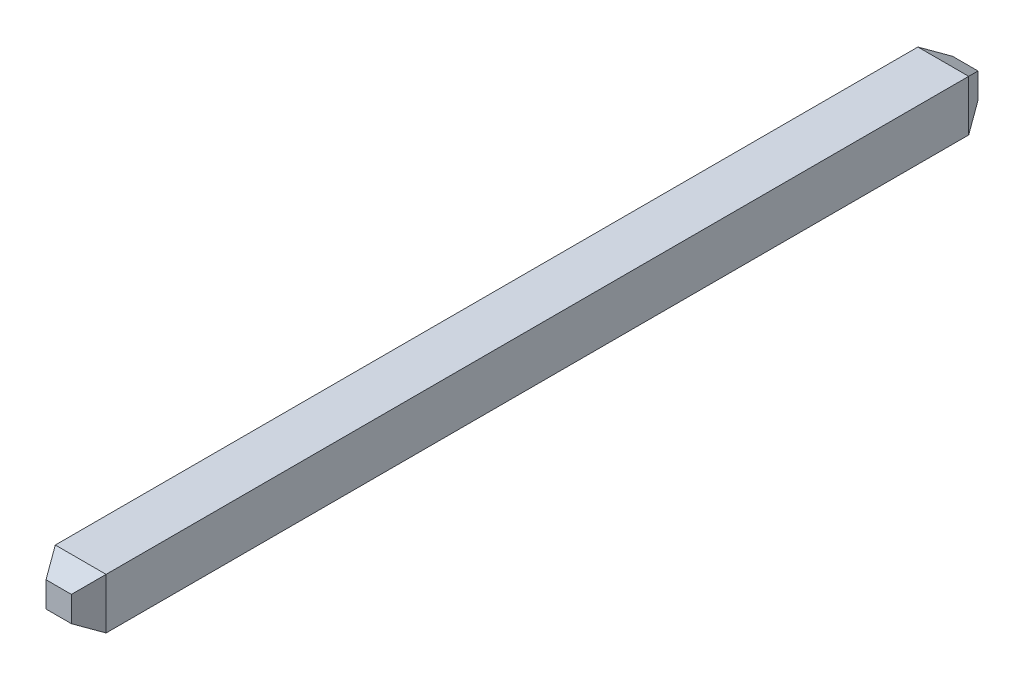
ISO-10303-21;
HEADER;
FILE_DESCRIPTION(('STEP AP214'),'2;1');
FILE_NAME('part.step','',(''),(''),'','','');
FILE_SCHEMA(('AUTOMOTIVE_DESIGN { 1 0 10303 214 1 1 1 1 }'));
ENDSEC;
DATA;
#1=APPLICATION_CONTEXT('core data for automotive mechanical design processes');
#2=APPLICATION_PROTOCOL_DEFINITION('international standard','automotive_design',2000,#1);
#3=PRODUCT_CONTEXT('',#1,'mechanical');
#4=PRODUCT('Part','Part','',(#3));
#5=PRODUCT_RELATED_PRODUCT_CATEGORY('part','',(#4));
#6=PRODUCT_DEFINITION_FORMATION('','',#4);
#7=PRODUCT_DEFINITION_CONTEXT('part definition',#1,'design');
#8=PRODUCT_DEFINITION('design','',#6,#7);
#9=PRODUCT_DEFINITION_SHAPE('','',#8);
#10=(LENGTH_UNIT() NAMED_UNIT(*) SI_UNIT(.MILLI.,.METRE.));
#11=(NAMED_UNIT(*) PLANE_ANGLE_UNIT() SI_UNIT($,.RADIAN.));
#12=(NAMED_UNIT(*) SI_UNIT($,.STERADIAN.) SOLID_ANGLE_UNIT());
#13=UNCERTAINTY_MEASURE_WITH_UNIT(LENGTH_MEASURE(1.E-05),#10,'distance_accuracy_value','');
#14=(GEOMETRIC_REPRESENTATION_CONTEXT(3) GLOBAL_UNCERTAINTY_ASSIGNED_CONTEXT((#13)) GLOBAL_UNIT_ASSIGNED_CONTEXT((#10,
#11,#12)) REPRESENTATION_CONTEXT('',''));
#15=CARTESIAN_POINT('',(0.,0.,0.));
#16=DIRECTION('',(0.,0.,1.));
#17=DIRECTION('',(1.,0.,0.));
#18=AXIS2_PLACEMENT_3D('',#15,#16,#17);
#19=CARTESIAN_POINT('',(2.865,0.325,-3.));
#20=DIRECTION('',(0.,1.,0.));
#21=DIRECTION('',(-1.,0.,0.));
#22=AXIS2_PLACEMENT_3D('',#19,#20,#21);
#23=PLANE('',#22);
#24=DIRECTION('',(-1.,0.,0.));
#25=VECTOR('',#24,1.);
#26=CARTESIAN_POINT('',(2.865,0.325,8.31854174377006));
#27=LINE('',#26,#25);
#28=CARTESIAN_POINT('',(2.865,0.325,8.31854174377006));
#29=VERTEX_POINT('',#28);
#30=CARTESIAN_POINT('',(2.215,0.325,8.31854174377006));
#31=VERTEX_POINT('',#30);
#32=EDGE_CURVE('E11',#29,#31,#27,.T.);
#33=ORIENTED_EDGE('',*,*,#32,.F.);
#34=DIRECTION('',(0.,0.,1.));
#35=VECTOR('',#34,1.);
#36=CARTESIAN_POINT('',(2.865,0.325,-2.71854174377006));
#37=LINE('',#36,#35);
#38=CARTESIAN_POINT('',(2.865,0.325,-2.71854174377006));
#39=VERTEX_POINT('',#38);
#40=EDGE_CURVE('E24',#39,#29,#37,.T.);
#41=ORIENTED_EDGE('',*,*,#40,.F.);
#42=DIRECTION('',(-1.,0.,0.));
#43=VECTOR('',#42,1.);
#44=CARTESIAN_POINT('',(2.865,0.325,-2.71854174377006));
#45=LINE('',#44,#43);
#46=CARTESIAN_POINT('',(2.215,0.325,-2.71854174377006));
#47=VERTEX_POINT('',#46);
#48=EDGE_CURVE('E155',#39,#47,#45,.T.);
#49=ORIENTED_EDGE('',*,*,#48,.T.);
#50=DIRECTION('',(0.,0.,1.));
#51=VECTOR('',#50,1.);
#52=CARTESIAN_POINT('',(2.215,0.325,-2.71854174377006));
#53=LINE('',#52,#51);
#54=EDGE_CURVE('E153',#47,#31,#53,.T.);
#55=ORIENTED_EDGE('',*,*,#54,.T.);
#56=EDGE_LOOP('',(#33,#41,#49,#55));
#57=FACE_BOUND('',#56,.T.);
#58=ADVANCED_FACE('F17',(#57),#23,.T.);
#59=CARTESIAN_POINT('',(3.75291651245989,0.325,8.31854174377006));
#60=DIRECTION('',(0.,0.86602540378444,0.499999999999997));
#61=DIRECTION('',(-1.,0.,0.));
#62=AXIS2_PLACEMENT_3D('',#59,#60,#61);
#63=PLANE('',#62);
#64=ORIENTED_EDGE('',*,*,#32,.T.);
#65=DIRECTION('',(0.447213595499954,-0.447213595499956,0.774596669241487));
#66=VECTOR('',#65,1.);
#67=CARTESIAN_POINT('',(2.215,0.325,8.31854174377006));
#68=LINE('',#67,#66);
#69=CARTESIAN_POINT('',(2.3775,0.1625,8.6));
#70=VERTEX_POINT('',#69);
#71=EDGE_CURVE('E151',#31,#70,#68,.T.);
#72=ORIENTED_EDGE('',*,*,#71,.T.);
#73=DIRECTION('',(-1.,0.,0.));
#74=VECTOR('',#73,1.);
#75=CARTESIAN_POINT('',(2.7025,0.1625,8.6));
#76=LINE('',#75,#74);
#77=CARTESIAN_POINT('',(2.7025,0.1625,8.6));
#78=VERTEX_POINT('',#77);
#79=EDGE_CURVE('E148',#78,#70,#76,.T.);
#80=ORIENTED_EDGE('',*,*,#79,.F.);
#81=DIRECTION('',(-0.447213595499957,-0.447213595499955,0.774596669241486));
#82=VECTOR('',#81,1.);
#83=CARTESIAN_POINT('',(2.865,0.325,8.31854174377006));
#84=LINE('',#83,#82);
#85=EDGE_CURVE('E145',#29,#78,#84,.T.);
#86=ORIENTED_EDGE('',*,*,#85,.F.);
#87=EDGE_LOOP('',(#64,#72,#80,#86));
#88=FACE_BOUND('',#87,.T.);
#89=ADVANCED_FACE('F161',(#88),#63,.T.);
#90=CARTESIAN_POINT('',(2.865,-0.325,-3.));
#91=DIRECTION('',(1.,0.,0.));
#92=DIRECTION('',(0.,1.,0.));
#93=AXIS2_PLACEMENT_3D('',#90,#91,#92);
#94=PLANE('',#93);
#95=DIRECTION('',(0.,1.,0.));
#96=VECTOR('',#95,1.);
#97=CARTESIAN_POINT('',(2.865,-0.325,8.31854174377006));
#98=LINE('',#97,#96);
#99=CARTESIAN_POINT('',(2.865,-0.325,8.31854174377006));
#100=VERTEX_POINT('',#99);
#101=EDGE_CURVE('E142',#100,#29,#98,.T.);
#102=ORIENTED_EDGE('',*,*,#101,.F.);
#103=DIRECTION('',(0.,0.,1.));
#104=VECTOR('',#103,1.);
#105=CARTESIAN_POINT('',(2.865,-0.325,-2.71854174377006));
#106=LINE('',#105,#104);
#107=CARTESIAN_POINT('',(2.865,-0.325,-2.71854174377006));
#108=VERTEX_POINT('',#107);
#109=EDGE_CURVE('E139',#108,#100,#106,.T.);
#110=ORIENTED_EDGE('',*,*,#109,.F.);
#111=DIRECTION('',(0.,1.,0.));
#112=VECTOR('',#111,1.);
#113=CARTESIAN_POINT('',(2.865,-0.325,-2.71854174377006));
#114=LINE('',#113,#112);
#115=EDGE_CURVE('E136',#108,#39,#114,.T.);
#116=ORIENTED_EDGE('',*,*,#115,.T.);
#117=ORIENTED_EDGE('',*,*,#40,.T.);
#118=EDGE_LOOP('',(#102,#110,#116,#117));
#119=FACE_BOUND('',#118,.T.);
#120=ADVANCED_FACE('F157',(#119),#94,.T.);
#121=CARTESIAN_POINT('',(3.75291651245989,0.325,-2.71854174377006));
#122=DIRECTION('',(0.,-0.866025403784438,0.5));
#123=DIRECTION('',(-1.,0.,0.));
#124=AXIS2_PLACEMENT_3D('',#121,#122,#123);
#125=PLANE('',#124);
#126=ORIENTED_EDGE('',*,*,#48,.F.);
#127=DIRECTION('',(-0.447213595499958,-0.447213595499958,-0.774596669241483));
#128=VECTOR('',#127,1.);
#129=CARTESIAN_POINT('',(2.865,0.325,-2.71854174377006));
#130=LINE('',#129,#128);
#131=CARTESIAN_POINT('',(2.7025,0.1625,-3.));
#132=VERTEX_POINT('',#131);
#133=EDGE_CURVE('E134',#39,#132,#130,.T.);
#134=ORIENTED_EDGE('',*,*,#133,.T.);
#135=DIRECTION('',(-1.,0.,0.));
#136=VECTOR('',#135,1.);
#137=CARTESIAN_POINT('',(2.7025,0.1625,-3.));
#138=LINE('',#137,#136);
#139=CARTESIAN_POINT('',(2.3775,0.1625,-3.));
#140=VERTEX_POINT('',#139);
#141=EDGE_CURVE('E132',#132,#140,#138,.T.);
#142=ORIENTED_EDGE('',*,*,#141,.T.);
#143=DIRECTION('',(0.447213595499957,-0.447213595499958,-0.774596669241484));
#144=VECTOR('',#143,1.);
#145=CARTESIAN_POINT('',(2.215,0.325,-2.71854174377006));
#146=LINE('',#145,#144);
#147=EDGE_CURVE('E96',#47,#140,#146,.T.);
#148=ORIENTED_EDGE('',*,*,#147,.F.);
#149=EDGE_LOOP('',(#126,#134,#142,#148));
#150=FACE_BOUND('',#149,.T.);
#151=ADVANCED_FACE('F177',(#150),#125,.F.);
#152=CARTESIAN_POINT('',(2.215,0.325,-3.));
#153=DIRECTION('',(-1.,0.,0.));
#154=DIRECTION('',(0.,-1.,0.));
#155=AXIS2_PLACEMENT_3D('',#152,#153,#154);
#156=PLANE('',#155);
#157=DIRECTION('',(0.,-1.,0.));
#158=VECTOR('',#157,1.);
#159=CARTESIAN_POINT('',(2.215,0.325,8.31854174377006));
#160=LINE('',#159,#158);
#161=CARTESIAN_POINT('',(2.215,-0.325,8.31854174377006));
#162=VERTEX_POINT('',#161);
#163=EDGE_CURVE('E129',#31,#162,#160,.T.);
#164=ORIENTED_EDGE('',*,*,#163,.F.);
#165=ORIENTED_EDGE('',*,*,#54,.F.);
#166=DIRECTION('',(0.,-1.,0.));
#167=VECTOR('',#166,1.);
#168=CARTESIAN_POINT('',(2.215,0.325,-2.71854174377006));
#169=LINE('',#168,#167);
#170=CARTESIAN_POINT('',(2.215,-0.325,-2.71854174377006));
#171=VERTEX_POINT('',#170);
#172=EDGE_CURVE('E127',#47,#171,#169,.T.);
#173=ORIENTED_EDGE('',*,*,#172,.T.);
#174=DIRECTION('',(0.,0.,1.));
#175=VECTOR('',#174,1.);
#176=CARTESIAN_POINT('',(2.215,-0.325,-2.71854174377006));
#177=LINE('',#176,#175);
#178=EDGE_CURVE('E124',#171,#162,#177,.T.);
#179=ORIENTED_EDGE('',*,*,#178,.T.);
#180=EDGE_LOOP('',(#164,#165,#173,#179));
#181=FACE_BOUND('',#180,.T.);
#182=ADVANCED_FACE('F182',(#181),#156,.T.);
#183=CARTESIAN_POINT('',(2.215,1.21291651245988,8.31854174377006));
#184=DIRECTION('',(-0.86602540378444,0.,0.499999999999998));
#185=DIRECTION('',(0.,-1.,0.));
#186=AXIS2_PLACEMENT_3D('',#183,#184,#185);
#187=PLANE('',#186);
#188=ORIENTED_EDGE('',*,*,#163,.T.);
#189=DIRECTION('',(0.447213595499957,0.447213595499955,0.774596669241486));
#190=VECTOR('',#189,1.);
#191=CARTESIAN_POINT('',(2.215,-0.325,8.31854174377006));
#192=LINE('',#191,#190);
#193=CARTESIAN_POINT('',(2.3775,-0.1625,8.6));
#194=VERTEX_POINT('',#193);
#195=EDGE_CURVE('E122',#162,#194,#192,.T.);
#196=ORIENTED_EDGE('',*,*,#195,.T.);
#197=DIRECTION('',(0.,-1.,0.));
#198=VECTOR('',#197,1.);
#199=CARTESIAN_POINT('',(2.3775,0.1625,8.6));
#200=LINE('',#199,#198);
#201=EDGE_CURVE('E119',#70,#194,#200,.T.);
#202=ORIENTED_EDGE('',*,*,#201,.F.);
#203=ORIENTED_EDGE('',*,*,#71,.F.);
#204=EDGE_LOOP('',(#188,#196,#202,#203));
#205=FACE_BOUND('',#204,.T.);
#206=ADVANCED_FACE('F184',(#205),#187,.T.);
#207=CARTESIAN_POINT('',(2.54,0.,8.6));
#208=DIRECTION('',(0.,0.,1.));
#209=DIRECTION('',(1.,0.,0.));
#210=AXIS2_PLACEMENT_3D('',#207,#208,#209);
#211=PLANE('',#210);
#212=ORIENTED_EDGE('',*,*,#79,.T.);
#213=ORIENTED_EDGE('',*,*,#201,.T.);
#214=DIRECTION('',(1.,0.,0.));
#215=VECTOR('',#214,1.);
#216=CARTESIAN_POINT('',(2.3775,-0.1625,8.6));
#217=LINE('',#216,#215);
#218=CARTESIAN_POINT('',(2.7025,-0.1625,8.6));
#219=VERTEX_POINT('',#218);
#220=EDGE_CURVE('E117',#194,#219,#217,.T.);
#221=ORIENTED_EDGE('',*,*,#220,.T.);
#222=DIRECTION('',(0.,1.,0.));
#223=VECTOR('',#222,1.);
#224=CARTESIAN_POINT('',(2.7025,-0.1625,8.6));
#225=LINE('',#224,#223);
#226=EDGE_CURVE('E114',#219,#78,#225,.T.);
#227=ORIENTED_EDGE('',*,*,#226,.T.);
#228=EDGE_LOOP('',(#212,#213,#221,#227));
#229=FACE_BOUND('',#228,.T.);
#230=ADVANCED_FACE('F187',(#229),#211,.T.);
#231=CARTESIAN_POINT('',(2.865,-1.21291651245988,8.31854174377006));
#232=DIRECTION('',(0.86602540378444,0.,0.499999999999998));
#233=DIRECTION('',(0.,1.,0.));
#234=AXIS2_PLACEMENT_3D('',#231,#232,#233);
#235=PLANE('',#234);
#236=ORIENTED_EDGE('',*,*,#101,.T.);
#237=ORIENTED_EDGE('',*,*,#85,.T.);
#238=ORIENTED_EDGE('',*,*,#226,.F.);
#239=DIRECTION('',(-0.447213595499954,0.447213595499956,0.774596669241487));
#240=VECTOR('',#239,1.);
#241=CARTESIAN_POINT('',(2.865,-0.325,8.31854174377006));
#242=LINE('',#241,#240);
#243=EDGE_CURVE('E111',#100,#219,#242,.T.);
#244=ORIENTED_EDGE('',*,*,#243,.F.);
#245=EDGE_LOOP('',(#236,#237,#238,#244));
#246=FACE_BOUND('',#245,.T.);
#247=ADVANCED_FACE('F165',(#246),#235,.T.);
#248=CARTESIAN_POINT('',(2.215,-0.325,-3.));
#249=DIRECTION('',(0.,-1.,0.));
#250=DIRECTION('',(1.,0.,0.));
#251=AXIS2_PLACEMENT_3D('',#248,#249,#250);
#252=PLANE('',#251);
#253=DIRECTION('',(1.,0.,0.));
#254=VECTOR('',#253,1.);
#255=CARTESIAN_POINT('',(2.215,-0.325,8.31854174377006));
#256=LINE('',#255,#254);
#257=EDGE_CURVE('E108',#162,#100,#256,.T.);
#258=ORIENTED_EDGE('',*,*,#257,.F.);
#259=ORIENTED_EDGE('',*,*,#178,.F.);
#260=DIRECTION('',(1.,0.,0.));
#261=VECTOR('',#260,1.);
#262=CARTESIAN_POINT('',(2.215,-0.325,-2.71854174377006));
#263=LINE('',#262,#261);
#264=EDGE_CURVE('E101',#171,#108,#263,.T.);
#265=ORIENTED_EDGE('',*,*,#264,.T.);
#266=ORIENTED_EDGE('',*,*,#109,.T.);
#267=EDGE_LOOP('',(#258,#259,#265,#266));
#268=FACE_BOUND('',#267,.T.);
#269=ADVANCED_FACE('F173',(#268),#252,.T.);
#270=CARTESIAN_POINT('',(2.865,-1.21291651245988,-2.71854174377006));
#271=DIRECTION('',(-0.866025403784438,0.,0.5));
#272=DIRECTION('',(0.,1.,0.));
#273=AXIS2_PLACEMENT_3D('',#270,#271,#272);
#274=PLANE('',#273);
#275=ORIENTED_EDGE('',*,*,#115,.F.);
#276=DIRECTION('',(-0.447213595499957,0.447213595499958,-0.774596669241484));
#277=VECTOR('',#276,1.);
#278=CARTESIAN_POINT('',(2.865,-0.325,-2.71854174377006));
#279=LINE('',#278,#277);
#280=CARTESIAN_POINT('',(2.7025,-0.1625,-3.));
#281=VERTEX_POINT('',#280);
#282=EDGE_CURVE('E105',#108,#281,#279,.T.);
#283=ORIENTED_EDGE('',*,*,#282,.T.);
#284=DIRECTION('',(0.,1.,0.));
#285=VECTOR('',#284,1.);
#286=CARTESIAN_POINT('',(2.7025,-0.1625,-3.));
#287=LINE('',#286,#285);
#288=EDGE_CURVE('E84',#281,#132,#287,.T.);
#289=ORIENTED_EDGE('',*,*,#288,.T.);
#290=ORIENTED_EDGE('',*,*,#133,.F.);
#291=EDGE_LOOP('',(#275,#283,#289,#290));
#292=FACE_BOUND('',#291,.T.);
#293=ADVANCED_FACE('F175',(#292),#274,.F.);
#294=CARTESIAN_POINT('',(2.54,0.,-3.));
#295=DIRECTION('',(0.,0.,1.));
#296=DIRECTION('',(1.,0.,0.));
#297=AXIS2_PLACEMENT_3D('',#294,#295,#296);
#298=PLANE('',#297);
#299=ORIENTED_EDGE('',*,*,#141,.F.);
#300=ORIENTED_EDGE('',*,*,#288,.F.);
#301=DIRECTION('',(1.,0.,0.));
#302=VECTOR('',#301,1.);
#303=CARTESIAN_POINT('',(2.3775,-0.1625,-3.));
#304=LINE('',#303,#302);
#305=CARTESIAN_POINT('',(2.3775,-0.1625,-3.));
#306=VERTEX_POINT('',#305);
#307=EDGE_CURVE('E78',#306,#281,#304,.T.);
#308=ORIENTED_EDGE('',*,*,#307,.F.);
#309=DIRECTION('',(0.,-1.,0.));
#310=VECTOR('',#309,1.);
#311=CARTESIAN_POINT('',(2.3775,0.1625,-3.));
#312=LINE('',#311,#310);
#313=EDGE_CURVE('E82',#140,#306,#312,.T.);
#314=ORIENTED_EDGE('',*,*,#313,.F.);
#315=EDGE_LOOP('',(#299,#300,#308,#314));
#316=FACE_BOUND('',#315,.T.);
#317=ADVANCED_FACE('F81',(#316),#298,.F.);
#318=CARTESIAN_POINT('',(2.215,1.21291651245988,-2.71854174377006));
#319=DIRECTION('',(0.866025403784438,0.,0.5));
#320=DIRECTION('',(0.,-1.,0.));
#321=AXIS2_PLACEMENT_3D('',#318,#319,#320);
#322=PLANE('',#321);
#323=ORIENTED_EDGE('',*,*,#172,.F.);
#324=ORIENTED_EDGE('',*,*,#147,.T.);
#325=ORIENTED_EDGE('',*,*,#313,.T.);
#326=DIRECTION('',(0.447213595499958,0.447213595499958,-0.774596669241483));
#327=VECTOR('',#326,1.);
#328=CARTESIAN_POINT('',(2.215,-0.325,-2.71854174377006));
#329=LINE('',#328,#327);
#330=EDGE_CURVE('E94',#171,#306,#329,.T.);
#331=ORIENTED_EDGE('',*,*,#330,.F.);
#332=EDGE_LOOP('',(#323,#324,#325,#331));
#333=FACE_BOUND('',#332,.T.);
#334=ADVANCED_FACE('F93',(#333),#322,.F.);
#335=CARTESIAN_POINT('',(1.32708348754012,-0.325,8.31854174377006));
#336=DIRECTION('',(0.,-0.86602540378444,0.499999999999997));
#337=DIRECTION('',(1.,0.,0.));
#338=AXIS2_PLACEMENT_3D('',#335,#336,#337);
#339=PLANE('',#338);
#340=ORIENTED_EDGE('',*,*,#257,.T.);
#341=ORIENTED_EDGE('',*,*,#243,.T.);
#342=ORIENTED_EDGE('',*,*,#220,.F.);
#343=ORIENTED_EDGE('',*,*,#195,.F.);
#344=EDGE_LOOP('',(#340,#341,#342,#343));
#345=FACE_BOUND('',#344,.T.);
#346=ADVANCED_FACE('F170',(#345),#339,.T.);
#347=CARTESIAN_POINT('',(1.32708348754012,-0.325,-2.71854174377006));
#348=DIRECTION('',(0.,0.866025403784438,0.5));
#349=DIRECTION('',(1.,0.,0.));
#350=AXIS2_PLACEMENT_3D('',#347,#348,#349);
#351=PLANE('',#350);
#352=ORIENTED_EDGE('',*,*,#264,.F.);
#353=ORIENTED_EDGE('',*,*,#330,.T.);
#354=ORIENTED_EDGE('',*,*,#307,.T.);
#355=ORIENTED_EDGE('',*,*,#282,.F.);
#356=EDGE_LOOP('',(#352,#353,#354,#355));
#357=FACE_BOUND('',#356,.T.);
#358=ADVANCED_FACE('F99',(#357),#351,.F.);
#359=CLOSED_SHELL('',(#58,#89,#120,#151,#182,#206,#230,#247,#269,#293,#317,#334,#346,#358));
#360=MANIFOLD_SOLID_BREP('B1',#359);
#361=ADVANCED_BREP_SHAPE_REPRESENTATION('',(#18,#360),#14);
#362=SHAPE_DEFINITION_REPRESENTATION(#9,#361);
ENDSEC;
END-ISO-10303-21;
